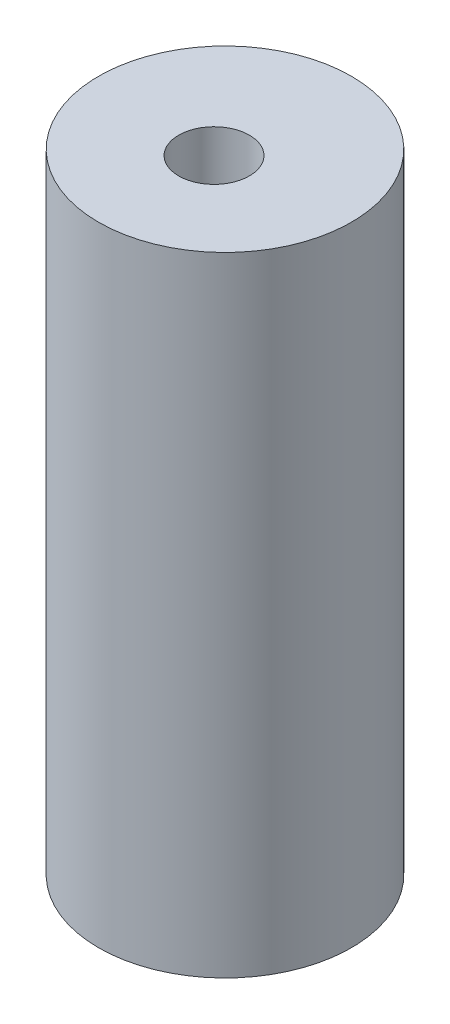
ISO-10303-21;
HEADER;
FILE_DESCRIPTION(('STEP AP214'),'2;1');
FILE_NAME('part.step','',(''),(''),'','','');
FILE_SCHEMA(('AUTOMOTIVE_DESIGN { 1 0 10303 214 1 1 1 1 }'));
ENDSEC;
DATA;
#1=APPLICATION_CONTEXT('core data for automotive mechanical design processes');
#2=APPLICATION_PROTOCOL_DEFINITION('international standard','automotive_design',2000,#1);
#3=PRODUCT_CONTEXT('',#1,'mechanical');
#4=PRODUCT('Part','Part','',(#3));
#5=PRODUCT_RELATED_PRODUCT_CATEGORY('part','',(#4));
#6=PRODUCT_DEFINITION_FORMATION('','',#4);
#7=PRODUCT_DEFINITION_CONTEXT('part definition',#1,'design');
#8=PRODUCT_DEFINITION('design','',#6,#7);
#9=PRODUCT_DEFINITION_SHAPE('','',#8);
#10=(LENGTH_UNIT() NAMED_UNIT(*) SI_UNIT(.MILLI.,.METRE.));
#11=(NAMED_UNIT(*) PLANE_ANGLE_UNIT() SI_UNIT($,.RADIAN.));
#12=(NAMED_UNIT(*) SI_UNIT($,.STERADIAN.) SOLID_ANGLE_UNIT());
#13=UNCERTAINTY_MEASURE_WITH_UNIT(LENGTH_MEASURE(1.E-05),#10,'distance_accuracy_value','');
#14=(GEOMETRIC_REPRESENTATION_CONTEXT(3) GLOBAL_UNCERTAINTY_ASSIGNED_CONTEXT((#13)) GLOBAL_UNIT_ASSIGNED_CONTEXT((#10,
#11,#12)) REPRESENTATION_CONTEXT('',''));
#15=CARTESIAN_POINT('',(0.,0.,0.));
#16=DIRECTION('',(0.,0.,1.));
#17=DIRECTION('',(1.,0.,0.));
#18=AXIS2_PLACEMENT_3D('',#15,#16,#17);
#19=CARTESIAN_POINT('',(0.,40.,0.));
#20=DIRECTION('',(0.,-1.,0.));
#21=DIRECTION('',(0.,0.,-1.));
#22=AXIS2_PLACEMENT_3D('',#19,#20,#21);
#23=CYLINDRICAL_SURFACE('',#22,8.05);
#24=CARTESIAN_POINT('',(0.,40.,0.));
#25=DIRECTION('',(0.,1.,0.));
#26=DIRECTION('',(0.,0.,1.));
#27=AXIS2_PLACEMENT_3D('',#24,#25,#26);
#28=CIRCLE('',#27,8.05);
#29=CARTESIAN_POINT('',(0.,40.,8.05));
#30=VERTEX_POINT('',#29);
#31=EDGE_CURVE('E10',#30,#30,#28,.T.);
#32=ORIENTED_EDGE('',*,*,#31,.F.);
#33=EDGE_LOOP('',(#32));
#34=FACE_BOUND('',#33,.T.);
#35=CARTESIAN_POINT('',(0.,0.,0.));
#36=DIRECTION('',(0.,1.,0.));
#37=DIRECTION('',(0.,0.,1.));
#38=AXIS2_PLACEMENT_3D('',#35,#36,#37);
#39=CIRCLE('',#38,8.05);
#40=CARTESIAN_POINT('',(0.,0.,8.05));
#41=VERTEX_POINT('',#40);
#42=EDGE_CURVE('E33',#41,#41,#39,.T.);
#43=ORIENTED_EDGE('',*,*,#42,.T.);
#44=EDGE_LOOP('',(#43));
#45=FACE_BOUND('',#44,.T.);
#46=ADVANCED_FACE('F30',(#34,#45),#23,.T.);
#47=CARTESIAN_POINT('',(0.,40.,0.));
#48=DIRECTION('',(0.,1.,0.));
#49=DIRECTION('',(0.,0.,1.));
#50=AXIS2_PLACEMENT_3D('',#47,#48,#49);
#51=PLANE('',#50);
#52=CARTESIAN_POINT('',(0.,40.,0.698463558762796));
#53=DIRECTION('',(0.,1.,0.));
#54=DIRECTION('',(0.,0.,1.));
#55=AXIS2_PLACEMENT_3D('',#52,#53,#54);
#56=CIRCLE('',#55,2.24999999999999);
#57=CARTESIAN_POINT('',(0.,40.,2.94846355876278));
#58=VERTEX_POINT('',#57);
#59=EDGE_CURVE('E44',#58,#58,#56,.T.);
#60=ORIENTED_EDGE('',*,*,#59,.F.);
#61=EDGE_LOOP('',(#60));
#62=FACE_BOUND('',#61,.T.);
#63=ORIENTED_EDGE('',*,*,#31,.T.);
#64=EDGE_LOOP('',(#63));
#65=FACE_BOUND('',#64,.T.);
#66=ADVANCED_FACE('F50',(#62,#65),#51,.T.);
#67=CARTESIAN_POINT('',(0.,0.,0.));
#68=DIRECTION('',(0.,1.,0.));
#69=DIRECTION('',(0.,0.,1.));
#70=AXIS2_PLACEMENT_3D('',#67,#68,#69);
#71=PLANE('',#70);
#72=CARTESIAN_POINT('',(0.,0.,0.698463558762796));
#73=DIRECTION('',(0.,1.,0.));
#74=DIRECTION('',(0.,0.,1.));
#75=AXIS2_PLACEMENT_3D('',#72,#73,#74);
#76=CIRCLE('',#75,2.24999999999999);
#77=CARTESIAN_POINT('',(0.,0.,2.94846355876279));
#78=VERTEX_POINT('',#77);
#79=EDGE_CURVE('E40',#78,#78,#76,.T.);
#80=ORIENTED_EDGE('',*,*,#79,.T.);
#81=EDGE_LOOP('',(#80));
#82=FACE_BOUND('',#81,.T.);
#83=ORIENTED_EDGE('',*,*,#42,.F.);
#84=EDGE_LOOP('',(#83));
#85=FACE_BOUND('',#84,.T.);
#86=ADVANCED_FACE('F52',(#82,#85),#71,.F.);
#87=CARTESIAN_POINT('',(0.,40.,0.698463558762796));
#88=DIRECTION('',(0.,1.,0.));
#89=DIRECTION('',(0.,0.,1.));
#90=AXIS2_PLACEMENT_3D('',#87,#88,#89);
#91=CYLINDRICAL_SURFACE('',#90,2.24999999999999);
#92=ORIENTED_EDGE('',*,*,#79,.F.);
#93=EDGE_LOOP('',(#92));
#94=FACE_BOUND('',#93,.T.);
#95=ORIENTED_EDGE('',*,*,#59,.T.);
#96=EDGE_LOOP('',(#95));
#97=FACE_BOUND('',#96,.T.);
#98=ADVANCED_FACE('F48',(#94,#97),#91,.F.);
#99=CLOSED_SHELL('',(#46,#66,#86,#98));
#100=MANIFOLD_SOLID_BREP('B2',#99);
#101=ADVANCED_BREP_SHAPE_REPRESENTATION('',(#18,#100),#14);
#102=SHAPE_DEFINITION_REPRESENTATION(#9,#101);
ENDSEC;
END-ISO-10303-21;
